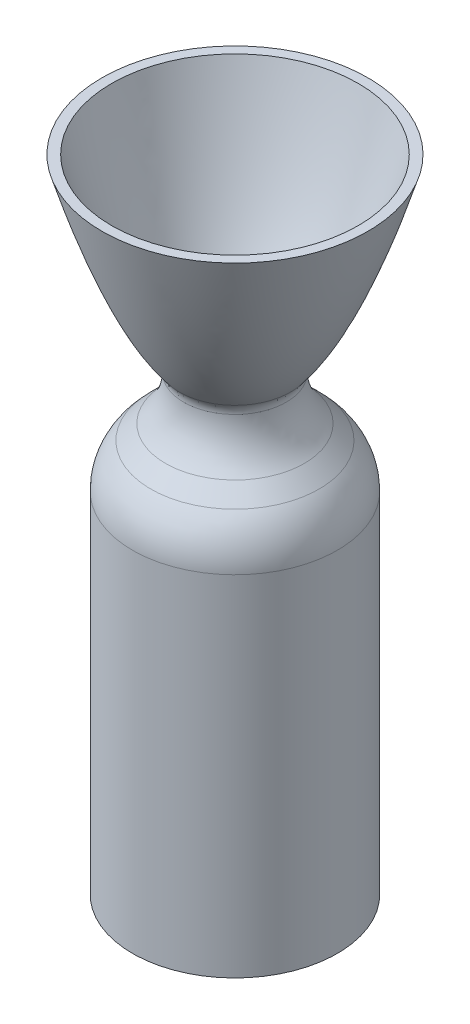
ISO-10303-21;
HEADER;
FILE_DESCRIPTION(('STEP AP214'),'2;1');
FILE_NAME('part.step','',(''),(''),'','','');
FILE_SCHEMA(('AUTOMOTIVE_DESIGN { 1 0 10303 214 1 1 1 1 }'));
ENDSEC;
DATA;
#1=APPLICATION_CONTEXT('core data for automotive mechanical design processes');
#2=APPLICATION_PROTOCOL_DEFINITION('international standard','automotive_design',2000,#1);
#3=PRODUCT_CONTEXT('',#1,'mechanical');
#4=PRODUCT('Part','Part','',(#3));
#5=PRODUCT_RELATED_PRODUCT_CATEGORY('part','',(#4));
#6=PRODUCT_DEFINITION_FORMATION('','',#4);
#7=PRODUCT_DEFINITION_CONTEXT('part definition',#1,'design');
#8=PRODUCT_DEFINITION('design','',#6,#7);
#9=PRODUCT_DEFINITION_SHAPE('','',#8);
#10=(LENGTH_UNIT() NAMED_UNIT(*) SI_UNIT(.MILLI.,.METRE.));
#11=(NAMED_UNIT(*) PLANE_ANGLE_UNIT() SI_UNIT($,.RADIAN.));
#12=(NAMED_UNIT(*) SI_UNIT($,.STERADIAN.) SOLID_ANGLE_UNIT());
#13=UNCERTAINTY_MEASURE_WITH_UNIT(LENGTH_MEASURE(1.E-05),#10,'distance_accuracy_value','');
#14=(GEOMETRIC_REPRESENTATION_CONTEXT(3) GLOBAL_UNCERTAINTY_ASSIGNED_CONTEXT((#13)) GLOBAL_UNIT_ASSIGNED_CONTEXT((#10,
#11,#12)) REPRESENTATION_CONTEXT('',''));
#15=CARTESIAN_POINT('',(0.,0.,0.));
#16=DIRECTION('',(0.,0.,1.));
#17=DIRECTION('',(1.,0.,0.));
#18=AXIS2_PLACEMENT_3D('',#15,#16,#17);
#19=CARTESIAN_POINT('',(26.7952792027428,6.50940032259606,0.));
#20=CARTESIAN_POINT('',(26.7445202608235,6.45863951350679,0.));
#21=CARTESIAN_POINT('',(26.67044207019,6.38228245127863,0.));
#22=CARTESIAN_POINT('',(26.5045552478752,6.20880231837584,0.));
#23=CARTESIAN_POINT('',(26.3663457558084,6.0501123088261,0.));
#24=CARTESIAN_POINT('',(26.1788763741962,5.83307431955689,0.));
#25=CARTESIAN_POINT('',(26.0044054743904,5.61088821502492,0.));
#26=CARTESIAN_POINT('',(25.7917882699891,5.32567960819241,0.));
#27=CARTESIAN_POINT('',(25.6025147209982,5.0458645334822,0.));
#28=CARTESIAN_POINT('',(25.41648850457,4.75146224774109,0.));
#29=CARTESIAN_POINT('',(25.2460122224941,4.45494379501456,0.));
#30=CARTESIAN_POINT('',(25.0840703005529,4.14944285659226,0.));
#31=CARTESIAN_POINT('',(24.935285976811,3.8398274049797,0.));
#32=CARTESIAN_POINT('',(24.7971967711735,3.52378782945289,0.));
#33=CARTESIAN_POINT('',(24.6716190705559,3.20350771325653,0.));
#34=CARTESIAN_POINT('',(24.5577414131155,2.87825331698411,0.));
#35=CARTESIAN_POINT('',(24.4563235712815,2.54940009295196,0.));
#36=CARTESIAN_POINT('',(24.3671416013245,2.21651509223236,0.));
#37=CARTESIAN_POINT('',(24.2905437014453,1.88115744920019,0.));
#38=CARTESIAN_POINT('',(24.2264993053653,1.54221117006489,0.));
#39=CARTESIAN_POINT('',(24.1751847188441,1.20269794512489,0.));
#40=CARTESIAN_POINT('',(24.1414350870908,0.90159400009664,0.));
#41=CARTESIAN_POINT('',(24.1205335987741,0.646924938525799,0.));
#42=CARTESIAN_POINT('',(24.1084615678794,0.427224789349872,0.));
#43=CARTESIAN_POINT('',(24.1020237227721,0.267801741635842,0.));
#44=CARTESIAN_POINT('',(24.099606331446,0.110274361763279,0.));
#45=CARTESIAN_POINT('',(24.0990685004946,0.0360533244193808,0.));
#46=CARTESIAN_POINT('',(24.0990678740505,0.000160672239889663,0.));
#47=B_SPLINE_CURVE_WITH_KNOTS('',4,(#19,#20,#21,#22,#23,#24,#25,#26,#27,#28,#29,#30,#31,#32,#33,
#34,#35,#36,#37,#38,#39,#40,#41,#42,#43,#44,#45,#46),.UNSPECIFIED.,.F.,.F.,(5,1,1,1,1,1,1,1,1,1,
1,1,1,1,1,1,1,1,1,1,1,1,1,1,5),(0.0825688161645696,0.122284452541055,0.142142270729318,
0.162000088917581,0.201715725294151,0.241431361670644,0.281146998047181,0.320862634423759,
0.360578270800262,0.400293907176806,0.440009543553384,0.479725179929891,0.519440816306429,
0.55915645268299,0.598872089059496,0.638587725436031,0.678303361812587,0.718018998189109,
0.75773463456565,0.797450270942201,0.837165907318734,0.857023725507005,0.876881543695275,
0.896739361883545,0.916597180071815),.UNSPECIFIED.);
#48=CARTESIAN_POINT('',(-0.00553212594954357,165.815985113531,0.));
#49=DIRECTION('',(0.,1.,0.));
#50=AXIS1_PLACEMENT('',#48,#49);
#51=SURFACE_OF_REVOLUTION('',#47,#50);
#52=CARTESIAN_POINT('',(-0.00553212594953341,0.000160669695714599,0.));
#53=DIRECTION('',(0.,1.,0.));
#54=DIRECTION('',(-1.,0.,0.));
#55=AXIS2_PLACEMENT_3D('',#52,#53,#54);
#56=CIRCLE('',#55,24.1045999999996);
#57=CARTESIAN_POINT('',(-24.1101321259491,0.000160669695713123,0.));
#58=VERTEX_POINT('',#57);
#59=EDGE_CURVE('E10',#58,#58,#56,.T.);
#60=ORIENTED_EDGE('',*,*,#59,.F.);
#61=EDGE_LOOP('',(#60));
#62=FACE_BOUND('',#61,.T.);
#63=CARTESIAN_POINT('',(-0.00553212594953381,6.50940032258687,0.));
#64=DIRECTION('',(0.,1.,0.));
#65=DIRECTION('',(-1.,0.,0.));
#66=AXIS2_PLACEMENT_3D('',#63,#64,#65);
#67=CIRCLE('',#66,26.8008113287013);
#68=CARTESIAN_POINT('',(-26.8063434546508,6.50940032258687,0.));
#69=VERTEX_POINT('',#68);
#70=EDGE_CURVE('E97',#69,#69,#67,.T.);
#71=ORIENTED_EDGE('',*,*,#70,.T.);
#72=EDGE_LOOP('',(#71));
#73=FACE_BOUND('',#72,.T.);
#74=ADVANCED_FACE('F37',(#62,#73),#51,.T.);
#75=CARTESIAN_POINT('',(24.09906787405,0.000160669695717676,0.));
#76=CARTESIAN_POINT('',(24.0990691047241,-0.0703679728464028,0.));
#77=CARTESIAN_POINT('',(24.0995982518181,-0.213423515475775,0.));
#78=CARTESIAN_POINT('',(24.1019739368417,-0.543022241674872,0.));
#79=CARTESIAN_POINT('',(24.1082983308862,-0.823999722416123,0.));
#80=CARTESIAN_POINT('',(24.1177834517832,-1.19466139734302,0.));
#81=CARTESIAN_POINT('',(24.1304257444387,-1.51327438396519,0.));
#82=CARTESIAN_POINT('',(24.1462259681665,-1.86177892891116,0.));
#83=CARTESIAN_POINT('',(24.1651812265014,-2.1935461974863,0.));
#84=CARTESIAN_POINT('',(24.1928188404251,-2.61790872568206,0.));
#85=CARTESIAN_POINT('',(24.2322870468909,-3.12187327267419,0.));
#86=CARTESIAN_POINT('',(24.3032997068341,-3.87981800096344,0.));
#87=CARTESIAN_POINT('',(24.4231266776924,-4.88628971453291,0.));
#88=CARTESIAN_POINT('',(24.5994860434932,-6.05655008714044,0.));
#89=CARTESIAN_POINT('',(24.8508852325236,-7.3850057422046,0.));
#90=CARTESIAN_POINT('',(25.1517953128692,-8.70341384262426,0.));
#91=CARTESIAN_POINT('',(25.5017706228882,-10.0094765375532,0.));
#92=CARTESIAN_POINT('',(25.9003609829589,-11.3016589265388,0.));
#93=CARTESIAN_POINT('',(26.3469453912588,-12.5779386658287,0.));
#94=CARTESIAN_POINT('',(26.8410033222054,-13.836726816028,0.));
#95=CARTESIAN_POINT('',(27.3816731213276,-15.0760364620747,0.));
#96=CARTESIAN_POINT('',(27.9684793860395,-16.2944491284191,0.));
#97=CARTESIAN_POINT('',(28.6001393970973,-17.4897781300036,0.));
#98=CARTESIAN_POINT('',(29.2765323953204,-18.661127094671,0.));
#99=CARTESIAN_POINT('',(29.9954451013151,-19.8055827357916,0.));
#100=CARTESIAN_POINT('',(30.7580219988686,-20.923699415831,0.));
#101=CARTESIAN_POINT('',(31.4591671920663,-21.8742511029654,0.));
#102=CARTESIAN_POINT('',(32.0887361224365,-22.6732848246303,0.));
#103=CARTESIAN_POINT('',(32.6241284158288,-23.3202614836393,0.));
#104=CARTESIAN_POINT('',(33.0722557674936,-23.8398443629595,0.));
#105=CARTESIAN_POINT('',(33.5084500255292,-24.3296555937091,0.));
#106=CARTESIAN_POINT('',(33.9358261207056,-24.7883237382633,0.));
#107=CARTESIAN_POINT('',(34.2455586391248,-25.1137076594102,0.));
#108=CARTESIAN_POINT('',(34.5368599569202,-25.4094883967124,0.));
#109=CARTESIAN_POINT('',(34.6364124248714,-25.5097892822269,0.));
#110=CARTESIAN_POINT('',(34.686282802579,-25.5596614673369,0.));
#111=B_SPLINE_CURVE_WITH_KNOTS('',4,(#75,#76,#77,#78,#79,#80,#81,#82,#83,#84,#85,#86,#87,#88,
#89,#90,#91,#92,#93,#94,#95,#96,#97,#98,#99,#100,#101,#102,#103,#104,#105,#106,#107,#108,#109,
#110),.UNSPECIFIED.,.F.,.F.,(5,1,1,1,1,1,1,1,1,1,1,1,1,1,1,1,1,1,1,1,1,1,1,1,1,1,1,1,1,1,1,1,5),
(0.0826377294276975,0.0925749264345495,0.10251212335078,0.11244932026701,0.122386517183241,
0.132323714099471,0.142260911015702,0.152198107931932,0.162135304848163,0.182009698680624,
0.201884092513085,0.241632880178006,0.281381667842927,0.321130455507848,0.360879243172768,
0.400628030837689,0.44037681850261,0.480125606167531,0.519874393832452,0.559623181497373,
0.599371969162294,0.639120756827214,0.678869544492136,0.718618332157059,0.758367119821983,
0.798115907486907,0.817990301319368,0.837864695151829,0.857739088984291,0.877613482816753,
0.897487876649217,0.907425073565449,0.917362270388778),.UNSPECIFIED.);
#112=CARTESIAN_POINT('',(-0.00553212594954357,165.815985113531,0.));
#113=DIRECTION('',(0.,1.,0.));
#114=AXIS1_PLACEMENT('',#112,#113);
#115=SURFACE_OF_REVOLUTION('',#111,#114);
#116=CARTESIAN_POINT('',(-0.00553212594953185,-25.5596614655474,0.));
#117=DIRECTION('',(0.,1.,0.));
#118=DIRECTION('',(-1.,0.,0.));
#119=AXIS2_PLACEMENT_3D('',#116,#117,#118);
#120=CIRCLE('',#119,34.6918149267068);
#121=CARTESIAN_POINT('',(-34.6973470526563,-25.5596614655474,0.));
#122=VERTEX_POINT('',#121);
#123=EDGE_CURVE('E45',#122,#122,#120,.T.);
#124=ORIENTED_EDGE('',*,*,#123,.F.);
#125=EDGE_LOOP('',(#124));
#126=FACE_BOUND('',#125,.T.);
#127=ORIENTED_EDGE('',*,*,#59,.T.);
#128=EDGE_LOOP('',(#127));
#129=FACE_BOUND('',#128,.T.);
#130=ADVANCED_FACE('F180',(#126,#129),#115,.T.);
#131=CARTESIAN_POINT('',(-0.00553212594953185,-25.5596614655474,0.));
#132=DIRECTION('',(0.,-1.,0.));
#133=DIRECTION('',(1.,0.,0.));
#134=AXIS2_PLACEMENT_3D('',#131,#132,#133);
#135=CONICAL_SURFACE('',#134,34.6918149267068,0.785398163415743);
#136=CARTESIAN_POINT('',(-0.00553212594953132,-34.1672896589686,0.));
#137=DIRECTION('',(0.,1.,0.));
#138=DIRECTION('',(-1.,0.,0.));
#139=AXIS2_PLACEMENT_3D('',#136,#137,#138);
#140=CIRCLE('',#139,43.2994431204428);
#141=CARTESIAN_POINT('',(-43.3049752463924,-34.1672896589686,0.));
#142=VERTEX_POINT('',#141);
#143=EDGE_CURVE('E50',#142,#142,#140,.T.);
#144=ORIENTED_EDGE('',*,*,#143,.F.);
#145=EDGE_LOOP('',(#144));
#146=FACE_BOUND('',#145,.T.);
#147=ORIENTED_EDGE('',*,*,#123,.T.);
#148=EDGE_LOOP('',(#147));
#149=FACE_BOUND('',#148,.T.);
#150=ADVANCED_FACE('F177',(#146,#149),#135,.F.);
#151=CARTESIAN_POINT('',(43.2939109944933,-34.1672896589686,0.));
#152=CARTESIAN_POINT('',(43.3437831535067,-34.2171620577288,0.));
#153=CARTESIAN_POINT('',(43.4443920749249,-34.3185162902184,0.));
#154=CARTESIAN_POINT('',(43.6740724087182,-34.5515494534129,0.));
#155=CARTESIAN_POINT('',(43.8739246264303,-34.7603401537522,0.));
#156=CARTESIAN_POINT('',(44.1814575050495,-35.0846311877743,0.));
#157=CARTESIAN_POINT('',(44.5147761918711,-35.446992659837,0.));
#158=CARTESIAN_POINT('',(44.9151269502498,-35.894247635304,0.));
#159=CARTESIAN_POINT('',(45.3528176825578,-36.4033812848166,0.));
#160=CARTESIAN_POINT('',(45.8935379392349,-37.0556721252782,0.));
#161=CARTESIAN_POINT('',(46.5198690622394,-37.8514517879027,0.));
#162=CARTESIAN_POINT('',(47.2231021398004,-38.8040762419941,0.));
#163=CARTESIAN_POINT('',(47.9844755213228,-39.9209726601051,0.));
#164=CARTESIAN_POINT('',(48.7041252303995,-41.0661548819658,0.));
#165=CARTESIAN_POINT('',(49.3801202320298,-42.2370932420432,0.));
#166=CARTESIAN_POINT('',(50.0120609291092,-43.4327015290297,0.));
#167=CARTESIAN_POINT('',(50.5987337538324,-44.6509688067741,0.));
#168=CARTESIAN_POINT('',(51.1395203620782,-45.8904084086378,0.));
#169=CARTESIAN_POINT('',(51.6335378319878,-47.1491350703917,0.));
#170=CARTESIAN_POINT('',(52.0243487401519,-48.2659692269763,0.));
#171=CARTESIAN_POINT('',(52.3292893411448,-49.23307774357,0.));
#172=CARTESIAN_POINT('',(52.6100142250863,-50.2074890415895,0.));
#173=CARTESIAN_POINT('',(52.8663751209586,-51.1885390868044,0.));
#174=CARTESIAN_POINT('',(53.0920641875106,-52.177442824755,0.));
#175=CARTESIAN_POINT('',(53.2868108227221,-53.1724252432346,0.));
#176=CARTESIAN_POINT('',(53.4566757867642,-54.17243543369,0.));
#177=CARTESIAN_POINT('',(53.5774268617541,-55.0081658638423,0.));
#178=CARTESIAN_POINT('',(53.6772884520342,-55.8484803692716,0.));
#179=CARTESIAN_POINT('',(53.756193121668,-56.6879981686387,0.));
#180=CARTESIAN_POINT('',(53.8004052848377,-57.2809599026071,0.));
#181=CARTESIAN_POINT('',(53.8304176257544,-57.7815944461254,0.));
#182=CARTESIAN_POINT('',(53.8501684535017,-58.2128376252088,0.));
#183=CARTESIAN_POINT('',(53.8628113510331,-58.5325674911422,0.));
#184=CARTESIAN_POINT('',(53.8722968380763,-58.9047954961338,0.));
#185=CARTESIAN_POINT('',(53.8786214369125,-59.1815646199112,0.));
#186=CARTESIAN_POINT('',(53.8809972871621,-59.5154061063821,0.));
#187=CARTESIAN_POINT('',(53.881526430117,-59.6569831600376,0.));
#188=CARTESIAN_POINT('',(53.8815276614586,-59.7275132132153,0.));
#189=B_SPLINE_CURVE_WITH_KNOTS('',4,(#151,#152,#153,#154,#155,#156,#157,#158,#159,#160,#161,
#162,#163,#164,#165,#166,#167,#168,#169,#170,#171,#172,#173,#174,#175,#176,#177,#178,#179,#180,
#181,#182,#183,#184,#185,#186,#187,#188),.UNSPECIFIED.,.F.,.F.,(5,1,1,1,1,1,1,1,1,1,1,1,1,1,1,1,
1,1,1,1,1,1,1,1,1,1,1,1,1,1,1,1,1,1,5),(0.0826377291939756,0.0925749257903485,0.102512122706581,
0.112449319622813,0.122386516539045,0.142260910371506,0.162135304203967,0.182009698036428,
0.201884091868889,0.24163287953381,0.281381667198732,0.321130454863653,0.360879242528575,
0.400628030193497,0.440376817858418,0.48012560552334,0.519874393188261,0.559623180853182,
0.599371968518103,0.619246362350565,0.639120756183026,0.678869543847947,0.718618331512868,
0.738492725345329,0.75836711917779,0.798115906842711,0.817990300675172,0.837864694507633,
0.857739088340094,0.867676285256324,0.877613482172555,0.887550679088785,0.897487876005016,
0.907425072921246,0.917362270161818),.UNSPECIFIED.);
#190=CARTESIAN_POINT('',(-0.00553212594954357,165.815985113531,0.));
#191=DIRECTION('',(0.,1.,0.));
#192=AXIS1_PLACEMENT('',#190,#191);
#193=SURFACE_OF_REVOLUTION('',#189,#192);
#194=CARTESIAN_POINT('',(-0.00553212594952976,-59.7275132223151,0.));
#195=DIRECTION('',(0.,1.,0.));
#196=DIRECTION('',(-1.,0.,0.));
#197=AXIS2_PLACEMENT_3D('',#194,#195,#196);
#198=CIRCLE('',#197,53.8870597874087);
#199=CARTESIAN_POINT('',(-53.8925919133582,-59.7275132223151,0.));
#200=VERTEX_POINT('',#199);
#201=EDGE_CURVE('E55',#200,#200,#198,.T.);
#202=ORIENTED_EDGE('',*,*,#201,.F.);
#203=EDGE_LOOP('',(#202));
#204=FACE_BOUND('',#203,.T.);
#205=ORIENTED_EDGE('',*,*,#143,.T.);
#206=EDGE_LOOP('',(#205));
#207=FACE_BOUND('',#206,.T.);
#208=ADVANCED_FACE('F173',(#204,#207),#193,.T.);
#209=CARTESIAN_POINT('',(-0.00553212594954357,165.815985113531,0.));
#210=DIRECTION('',(0.,1.,0.));
#211=DIRECTION('',(-1.,0.,0.));
#212=AXIS2_PLACEMENT_3D('',#209,#210,#211);
#213=CYLINDRICAL_SURFACE('',#212,53.8870597874087);
#214=CARTESIAN_POINT('',(-0.00553212594951731,-262.927513222315,0.));
#215=DIRECTION('',(0.,1.,0.));
#216=DIRECTION('',(-1.,0.,0.));
#217=AXIS2_PLACEMENT_3D('',#214,#215,#216);
#218=CIRCLE('',#217,53.8870597874087);
#219=CARTESIAN_POINT('',(-53.8925919133582,-262.927513222315,0.));
#220=VERTEX_POINT('',#219);
#221=EDGE_CURVE('E61',#220,#220,#218,.T.);
#222=ORIENTED_EDGE('',*,*,#221,.F.);
#223=EDGE_LOOP('',(#222));
#224=FACE_BOUND('',#223,.T.);
#225=ORIENTED_EDGE('',*,*,#201,.T.);
#226=EDGE_LOOP('',(#225));
#227=FACE_BOUND('',#226,.T.);
#228=ADVANCED_FACE('F169',(#224,#227),#213,.F.);
#229=CARTESIAN_POINT('',(-0.00553212594951731,-262.927513222315,0.));
#230=DIRECTION('',(0.,-1.,0.));
#231=DIRECTION('',(1.,0.,0.));
#232=AXIS2_PLACEMENT_3D('',#229,#230,#231);
#233=CONICAL_SURFACE('',#232,53.8870597874087,1.56778422709488);
#234=CARTESIAN_POINT('',(-0.00553212594951731,-262.944683547694,0.));
#235=DIRECTION('',(0.,1.,0.));
#236=DIRECTION('',(-1.,0.,0.));
#237=AXIS2_PLACEMENT_3D('',#234,#235,#236);
#238=CIRCLE('',#237,59.5874930935831);
#239=CARTESIAN_POINT('',(-59.5930252195326,-262.944683547694,0.));
#240=VERTEX_POINT('',#239);
#241=EDGE_CURVE('E65',#240,#240,#238,.T.);
#242=ORIENTED_EDGE('',*,*,#241,.F.);
#243=EDGE_LOOP('',(#242));
#244=FACE_BOUND('',#243,.T.);
#245=ORIENTED_EDGE('',*,*,#221,.T.);
#246=EDGE_LOOP('',(#245));
#247=FACE_BOUND('',#246,.T.);
#248=ADVANCED_FACE('F165',(#244,#247),#233,.F.);
#249=CARTESIAN_POINT('',(-0.00553212594954357,165.815985113531,0.));
#250=DIRECTION('',(0.,1.,0.));
#251=DIRECTION('',(-1.,0.,0.));
#252=AXIS2_PLACEMENT_3D('',#249,#250,#251);
#253=CYLINDRICAL_SURFACE('',#252,59.5874930935828);
#254=CARTESIAN_POINT('',(-0.00553212594952975,-59.7446835385943,0.));
#255=DIRECTION('',(0.,1.,0.));
#256=DIRECTION('',(-1.,0.,0.));
#257=AXIS2_PLACEMENT_3D('',#254,#255,#256);
#258=CIRCLE('',#257,59.5874930935825);
#259=CARTESIAN_POINT('',(-59.593025219532,-59.7446835385943,0.));
#260=VERTEX_POINT('',#259);
#261=EDGE_CURVE('E69',#260,#260,#258,.T.);
#262=ORIENTED_EDGE('',*,*,#261,.F.);
#263=EDGE_LOOP('',(#262));
#264=FACE_BOUND('',#263,.T.);
#265=ORIENTED_EDGE('',*,*,#241,.T.);
#266=EDGE_LOOP('',(#265));
#267=FACE_BOUND('',#266,.T.);
#268=ADVANCED_FACE('F161',(#264,#267),#253,.T.);
#269=CARTESIAN_POINT('',(59.5819609676329,-59.7446835385943,0.));
#270=CARTESIAN_POINT('',(59.5819597362459,-59.6741534854167,0.));
#271=CARTESIAN_POINT('',(59.5814305931997,-59.5325764317615,0.));
#272=CARTESIAN_POINT('',(59.5790547427348,-59.1987349452921,0.));
#273=CARTESIAN_POINT('',(59.5727301437201,-58.9219658215188,0.));
#274=CARTESIAN_POINT('',(59.5632446564368,-58.5497378165334,0.));
#275=CARTESIAN_POINT('',(59.5506017586993,-58.2300079506081,0.));
#276=CARTESIAN_POINT('',(59.5308509306739,-57.7987647715375,0.));
#277=CARTESIAN_POINT('',(59.5008385894344,-57.2981302280386,0.));
#278=CARTESIAN_POINT('',(59.4566264258823,-56.7051684940986,0.));
#279=CARTESIAN_POINT('',(59.3777217557071,-55.8656506947824,0.));
#280=CARTESIAN_POINT('',(59.2778601648851,-55.0253361894175,0.));
#281=CARTESIAN_POINT('',(59.1571090893563,-54.1896057593431,0.));
#282=CARTESIAN_POINT('',(58.9872441246693,-53.1895955689972,0.));
#283=CARTESIAN_POINT('',(58.7924974888162,-52.1946131506432,0.));
#284=CARTESIAN_POINT('',(58.5668084216265,-51.2057094128381,0.));
#285=CARTESIAN_POINT('',(58.3104475251215,-50.2246593677886,0.));
#286=CARTESIAN_POINT('',(58.0297226405517,-49.2502480699501,0.));
#287=CARTESIAN_POINT('',(57.7247820389351,-48.283139553553,0.));
#288=CARTESIAN_POINT('',(57.3339711300508,-47.1663053972204,0.));
#289=CARTESIAN_POINT('',(56.8399536593295,-45.9075787357851,0.));
#290=CARTESIAN_POINT('',(56.2991670502845,-44.6681391342701,0.));
#291=CARTESIAN_POINT('',(55.7124942247757,-43.4498718569041,0.));
#292=CARTESIAN_POINT('',(55.0805535269252,-42.2542635703251,0.));
#293=CARTESIAN_POINT('',(54.4045585245399,-41.0833252106836,0.));
#294=CARTESIAN_POINT('',(53.6849088147246,-39.938142989287,0.));
#295=CARTESIAN_POINT('',(52.923535432482,-38.821246571667,0.));
#296=CARTESIAN_POINT('',(52.2203023543067,-37.868622118029,0.));
#297=CARTESIAN_POINT('',(51.593971230789,-37.0728424558085,0.));
#298=CARTESIAN_POINT('',(51.0532509736912,-36.4205516156956,0.));
#299=CARTESIAN_POINT('',(50.615560241055,-35.9114179664652,0.));
#300=CARTESIAN_POINT('',(50.2152094823879,-35.4641629912564,0.));
#301=CARTESIAN_POINT('',(49.8818907953326,-35.1018015194086,0.));
#302=CARTESIAN_POINT('',(49.5743579165043,-34.7775104855849,0.));
#303=CARTESIAN_POINT('',(49.3745056986575,-34.5687197853744,0.));
#304=CARTESIAN_POINT('',(49.1448253647139,-34.335686622328,0.));
#305=CARTESIAN_POINT('',(49.0442164432304,-34.2343323899033,0.));
#306=CARTESIAN_POINT('',(48.9943442841848,-34.1844599911752,0.));
#307=B_SPLINE_CURVE_WITH_KNOTS('',4,(#269,#270,#271,#272,#273,#274,#275,#276,#277,#278,#279,
#280,#281,#282,#283,#284,#285,#286,#287,#288,#289,#290,#291,#292,#293,#294,#295,#296,#297,#298,
#299,#300,#301,#302,#303,#304,#305,#306),.UNSPECIFIED.,.F.,.F.,(5,1,1,1,1,1,1,1,1,1,1,1,1,1,1,1,
1,1,1,1,1,1,1,1,1,1,1,1,1,1,1,1,1,1,5),(0.0826377291939837,0.0925749264345476,0.102512123350778,
0.112449320267009,0.122386517183239,0.132323714099469,0.1422609110157,0.162135304848161,
0.182009698680622,0.201884092513083,0.241632880178004,0.261507274010465,0.281381667842925,
0.321130455507847,0.360879243172768,0.380753637005229,0.40062803083769,0.440376818502612,
0.480125606167533,0.519874393832454,0.559623181497376,0.599371969162297,0.639120756827219,
0.67886954449214,0.718618332157062,0.758367119821984,0.798115907486905,0.817990301319366,
0.837864695151827,0.857739088984288,0.877613482816748,0.887550679732981,0.897487876649213,
0.907425073565445,0.917362270161824),.UNSPECIFIED.);
#308=CARTESIAN_POINT('',(-0.00553212594954357,165.815985113531,0.));
#309=DIRECTION('',(0.,1.,0.));
#310=AXIS1_PLACEMENT('',#308,#309);
#311=SURFACE_OF_REVOLUTION('',#307,#310);
#312=CARTESIAN_POINT('',(-0.00553212594953132,-34.1844599976285,0.));
#313=DIRECTION('',(0.,1.,0.));
#314=DIRECTION('',(-1.,0.,0.));
#315=AXIS2_PLACEMENT_3D('',#312,#313,#314);
#316=CIRCLE('',#315,48.9998764165239);
#317=CARTESIAN_POINT('',(-49.0054085424734,-34.1844599976285,0.));
#318=VERTEX_POINT('',#317);
#319=EDGE_CURVE('E73',#318,#318,#316,.T.);
#320=ORIENTED_EDGE('',*,*,#319,.F.);
#321=EDGE_LOOP('',(#320));
#322=FACE_BOUND('',#321,.T.);
#323=ORIENTED_EDGE('',*,*,#261,.T.);
#324=EDGE_LOOP('',(#323));
#325=FACE_BOUND('',#324,.T.);
#326=ADVANCED_FACE('F157',(#322,#325),#311,.T.);
#327=CARTESIAN_POINT('',(-0.00553212594953132,-34.1844599976285,0.));
#328=DIRECTION('',(0.,-1.,0.));
#329=DIRECTION('',(1.,0.,0.));
#330=AXIS2_PLACEMENT_3D('',#327,#328,#329);
#331=CONICAL_SURFACE('',#330,48.9998764165239,0.785398163410157);
#332=CARTESIAN_POINT('',(-0.00553212594953185,-25.5768317995429,0.));
#333=DIRECTION('',(0.,1.,0.));
#334=DIRECTION('',(-1.,0.,0.));
#335=AXIS2_PLACEMENT_3D('',#332,#333,#334);
#336=CIRCLE('',#335,40.3922482182196);
#337=CARTESIAN_POINT('',(-40.3977803441691,-25.5768317995429,0.));
#338=VERTEX_POINT('',#337);
#339=EDGE_CURVE('E77',#338,#338,#336,.T.);
#340=ORIENTED_EDGE('',*,*,#339,.F.);
#341=EDGE_LOOP('',(#340));
#342=FACE_BOUND('',#341,.T.);
#343=ORIENTED_EDGE('',*,*,#319,.T.);
#344=EDGE_LOOP('',(#343));
#345=FACE_BOUND('',#344,.T.);
#346=ADVANCED_FACE('F160',(#342,#345),#331,.T.);
#347=CARTESIAN_POINT('',(40.38671609227,-25.5768317995429,0.));
#348=CARTESIAN_POINT('',(40.3368457145353,-25.52695961446,0.));
#349=CARTESIAN_POINT('',(40.2372932465299,-25.4266587289994,0.));
#350=CARTESIAN_POINT('',(39.9459919285743,-25.1308779918549,0.));
#351=CARTESIAN_POINT('',(39.6362594099789,-24.8054940708758,0.));
#352=CARTESIAN_POINT('',(39.208883314554,-24.346825926553,0.));
#353=CARTESIAN_POINT('',(38.7726890562532,-23.8570146960396,0.));
#354=CARTESIAN_POINT('',(38.324561704307,-23.3374318169621,0.));
#355=CARTESIAN_POINT('',(37.7891694105643,-22.6904551582431,0.));
#356=CARTESIAN_POINT('',(37.1596004797613,-21.8914214369192,0.));
#357=CARTESIAN_POINT('',(36.4584552860488,-20.9408697501645,0.));
#358=CARTESIAN_POINT('',(35.6958783878899,-19.8227530705381,0.));
#359=CARTESIAN_POINT('',(34.9769656812753,-18.6782974298068,0.));
#360=CARTESIAN_POINT('',(34.3005726824179,-17.5069484655058,0.));
#361=CARTESIAN_POINT('',(33.6689126707127,-16.3116194642633,0.));
#362=CARTESIAN_POINT('',(33.0821064053408,-15.0932067982367,0.));
#363=CARTESIAN_POINT('',(32.5414366055475,-13.8538971524829,0.));
#364=CARTESIAN_POINT('',(32.0473786739191,-12.5951090025511,0.));
#365=CARTESIAN_POINT('',(31.6007942649281,-11.3188292635031,0.));
#366=CARTESIAN_POINT('',(31.2022039041576,-10.0266468747334,0.));
#367=CARTESIAN_POINT('',(30.8522285934312,-8.72058417999397,0.));
#368=CARTESIAN_POINT('',(30.5513185123716,-7.40217607973728,0.));
#369=CARTESIAN_POINT('',(30.2999193226217,-6.07372042480927,0.));
#370=CARTESIAN_POINT('',(30.1235599561871,-4.90346005229725,0.));
#371=CARTESIAN_POINT('',(30.0037329847837,-3.89698833879268,0.));
#372=CARTESIAN_POINT('',(29.93272032443,-3.13904361054189,0.));
#373=CARTESIAN_POINT('',(29.8932521176913,-2.63507906357114,0.));
#374=CARTESIAN_POINT('',(29.8656145035378,-2.21071653539034,0.));
#375=CARTESIAN_POINT('',(29.8466592450232,-1.87894926682547,0.));
#376=CARTESIAN_POINT('',(29.8308590211067,-1.53044472188806,0.));
#377=CARTESIAN_POINT('',(29.8182167282787,-1.21183173527272,0.));
#378=CARTESIAN_POINT('',(29.8087316071809,-0.841170060350969,0.));
#379=CARTESIAN_POINT('',(29.8024072129842,-0.560192579613143,0.));
#380=CARTESIAN_POINT('',(29.8000315277821,-0.230593853415333,0.));
#381=CARTESIAN_POINT('',(29.7995023806107,-0.0875383107862467,0.));
#382=CARTESIAN_POINT('',(29.7995011498984,-0.0170096682441269,0.));
#383=B_SPLINE_CURVE_WITH_KNOTS('',4,(#347,#348,#349,#350,#351,#352,#353,#354,#355,#356,#357,
#358,#359,#360,#361,#362,#363,#364,#365,#366,#367,#368,#369,#370,#371,#372,#373,#374,#375,#376,
#377,#378,#379,#380,#381,#382),.UNSPECIFIED.,.F.,.F.,(5,1,1,1,1,1,1,1,1,1,1,1,1,1,1,1,1,1,1,1,1,
1,1,1,1,1,1,1,1,1,1,1,5),(0.082637729427731,0.0925749262510766,0.102512123167309,
0.122386516999773,0.142260910832234,0.162135304664696,0.182009698497157,0.201884092329619,
0.241632879994542,0.281381667659466,0.321130455324389,0.360879242989311,0.400628030654232,
0.440376818319152,0.480125605984073,0.519874393648994,0.559623181313916,0.599371968978837,
0.639120756643757,0.678869544308678,0.718618331973599,0.75836711963852,0.798115907303441,
0.817990301135902,0.837864694968362,0.847801891884593,0.857739088800824,0.867676285717054,
0.877613482633285,0.887550679549515,0.897487876465746,0.907425073381976,0.917362270388794),.UNSPECIFIED.);
#384=CARTESIAN_POINT('',(-0.00553212594954357,165.815985113531,0.));
#385=DIRECTION('',(0.,1.,0.));
#386=AXIS1_PLACEMENT('',#384,#385);
#387=SURFACE_OF_REVOLUTION('',#383,#386);
#388=CARTESIAN_POINT('',(-0.00553212594953341,-0.0170096657008956,0.));
#389=DIRECTION('',(0.,1.,0.));
#390=DIRECTION('',(-1.,0.,0.));
#391=AXIS2_PLACEMENT_3D('',#388,#389,#390);
#392=CIRCLE('',#391,29.8050332758479);
#393=CARTESIAN_POINT('',(-29.8105654017974,-0.0170096657008974,0.));
#394=VERTEX_POINT('',#393);
#395=EDGE_CURVE('E81',#394,#394,#392,.T.);
#396=ORIENTED_EDGE('',*,*,#395,.F.);
#397=EDGE_LOOP('',(#396));
#398=FACE_BOUND('',#397,.T.);
#399=ORIENTED_EDGE('',*,*,#339,.T.);
#400=EDGE_LOOP('',(#399));
#401=FACE_BOUND('',#400,.T.);
#402=ADVANCED_FACE('F128',(#398,#401),#387,.T.);
#403=CARTESIAN_POINT('',(29.7995011498983,-0.0170096657009076,0.));
#404=CARTESIAN_POINT('',(29.7995017763426,0.0188829864747169,0.));
#405=CARTESIAN_POINT('',(29.8000396072942,0.0931040238178571,0.));
#406=CARTESIAN_POINT('',(29.8024569986206,0.250631403682601,0.));
#407=CARTESIAN_POINT('',(29.8088948437279,0.410054451391841,0.));
#408=CARTESIAN_POINT('',(29.820966874623,0.62975460056775,0.));
#409=CARTESIAN_POINT('',(29.84186836294,0.884423662138558,0.));
#410=CARTESIAN_POINT('',(29.8756179946938,1.18552760716676,0.));
#411=CARTESIAN_POINT('',(29.9269325812155,1.52504083210667,0.));
#412=CARTESIAN_POINT('',(29.990976977296,1.86398711124188,0.));
#413=CARTESIAN_POINT('',(30.0675748771758,2.19934475427393,0.));
#414=CARTESIAN_POINT('',(30.1567568471333,2.53222975499339,0.));
#415=CARTESIAN_POINT('',(30.2581746889678,2.86108297902538,0.));
#416=CARTESIAN_POINT('',(30.3720523464086,3.18633737529763,0.));
#417=CARTESIAN_POINT('',(30.4976300470268,3.5066174914938,0.));
#418=CARTESIAN_POINT('',(30.6357192526648,3.8226570670204,0.));
#419=CARTESIAN_POINT('',(30.7845035764071,4.13227251863273,0.));
#420=CARTESIAN_POINT('',(30.9464454983488,4.43777345705478,0.));
#421=CARTESIAN_POINT('',(31.1169217804252,4.73429190978105,0.));
#422=CARTESIAN_POINT('',(31.3029479968538,5.02869419552186,0.));
#423=CARTESIAN_POINT('',(31.4922215458452,5.30850927023179,0.));
#424=CARTESIAN_POINT('',(31.7048387502469,5.59371787706397,0.));
#425=CARTESIAN_POINT('',(31.8793096500531,5.81590398159567,0.));
#426=CARTESIAN_POINT('',(32.0667790316655,6.03294197086459,0.));
#427=CARTESIAN_POINT('',(32.2049885237325,6.19163198041396,0.));
#428=CARTESIAN_POINT('',(32.3708753460472,6.36511211331613,0.));
#429=CARTESIAN_POINT('',(32.4449535366809,6.44146917554424,0.));
#430=CARTESIAN_POINT('',(32.4957124786001,6.49222998463327,0.));
#431=B_SPLINE_CURVE_WITH_KNOTS('',4,(#403,#404,#405,#406,#407,#408,#409,#410,#411,#412,#413,
#414,#415,#416,#417,#418,#419,#420,#421,#422,#423,#424,#425,#426,#427,#428,#429,#430),
.UNSPECIFIED.,.F.,.F.,(5,1,1,1,1,1,1,1,1,1,1,1,1,1,1,1,1,1,1,1,1,1,1,1,5),(0.0825688161645696,
0.102426634352839,0.122284452541109,0.14214227072938,0.16200008891765,0.201715725294183,
0.241431361670735,0.281146998047275,0.320862634423797,0.360578270800353,0.400293907176888,
0.440009543553394,0.479725179929955,0.519440816306493,0.559156452683,0.598872089059578,
0.638587725436122,0.678303361812625,0.718018998189203,0.75773463456574,0.797450270942234,
0.837165907318803,0.857023725507066,0.876881543695329,0.916597180071815),.UNSPECIFIED.);
#432=CARTESIAN_POINT('',(-0.00553212594954357,165.815985113531,0.));
#433=DIRECTION('',(0.,1.,0.));
#434=AXIS1_PLACEMENT('',#432,#433);
#435=SURFACE_OF_REVOLUTION('',#431,#434);
#436=CARTESIAN_POINT('',(-0.00553212594953381,6.49222998463328,0.));
#437=DIRECTION('',(0.,1.,0.));
#438=DIRECTION('',(-1.,0.,0.));
#439=AXIS2_PLACEMENT_3D('',#436,#437,#438);
#440=CIRCLE('',#439,32.5012446045496);
#441=CARTESIAN_POINT('',(-32.5067767304991,6.49222998463328,0.));
#442=VERTEX_POINT('',#441);
#443=EDGE_CURVE('E85',#442,#442,#440,.T.);
#444=ORIENTED_EDGE('',*,*,#443,.F.);
#445=EDGE_LOOP('',(#444));
#446=FACE_BOUND('',#445,.T.);
#447=ORIENTED_EDGE('',*,*,#395,.T.);
#448=EDGE_LOOP('',(#447));
#449=FACE_BOUND('',#448,.T.);
#450=ADVANCED_FACE('F124',(#446,#449),#435,.T.);
#451=CARTESIAN_POINT('',(32.4957124786001,6.49222998463327,0.));
#452=CARTESIAN_POINT('',(54.9510800068366,34.6275313960997,0.));
#453=CARTESIAN_POINT('',(77.3884161649985,109.927507640385,0.));
#454=B_SPLINE_CURVE_WITH_KNOTS('',2,(#451,#452,#453),.UNSPECIFIED.,.F.,.F.,(3,3),(0.,1.),.UNSPECIFIED.);
#455=CARTESIAN_POINT('',(-0.00553212594954357,165.815985113531,0.));
#456=DIRECTION('',(0.,1.,0.));
#457=AXIS1_PLACEMENT('',#455,#456);
#458=SURFACE_OF_REVOLUTION('',#454,#457);
#459=CARTESIAN_POINT('',(-0.00553212594954014,109.927507640385,0.));
#460=DIRECTION('',(0.,1.,0.));
#461=DIRECTION('',(-1.,0.,0.));
#462=AXIS2_PLACEMENT_3D('',#459,#460,#461);
#463=CIRCLE('',#462,77.393948290948);
#464=CARTESIAN_POINT('',(-77.3994804168976,109.927507640385,0.));
#465=VERTEX_POINT('',#464);
#466=EDGE_CURVE('E89',#465,#465,#463,.T.);
#467=ORIENTED_EDGE('',*,*,#466,.F.);
#468=EDGE_LOOP('',(#467));
#469=FACE_BOUND('',#468,.T.);
#470=ORIENTED_EDGE('',*,*,#443,.T.);
#471=EDGE_LOOP('',(#470));
#472=FACE_BOUND('',#471,.T.);
#473=ADVANCED_FACE('F120',(#469,#472),#458,.T.);
#474=CARTESIAN_POINT('',(71.7275236025302,109.927507640385,0.));
#475=DIRECTION('',(0.,-1.,0.));
#476=DIRECTION('',(1.,0.,0.));
#477=AXIS2_PLACEMENT_3D('',#474,#475,#476);
#478=PLANE('',#477);
#479=CARTESIAN_POINT('',(-0.00553212594954014,109.927507640385,0.));
#480=DIRECTION('',(0.,1.,0.));
#481=DIRECTION('',(-1.,0.,0.));
#482=AXIS2_PLACEMENT_3D('',#479,#480,#481);
#483=CIRCLE('',#482,71.7330557284818);
#484=CARTESIAN_POINT('',(-71.7385878544314,109.927507640385,0.));
#485=VERTEX_POINT('',#484);
#486=EDGE_CURVE('E93',#485,#485,#483,.T.);
#487=ORIENTED_EDGE('',*,*,#486,.F.);
#488=EDGE_LOOP('',(#487));
#489=FACE_BOUND('',#488,.T.);
#490=ORIENTED_EDGE('',*,*,#466,.T.);
#491=EDGE_LOOP('',(#490));
#492=FACE_BOUND('',#491,.T.);
#493=ADVANCED_FACE('F116',(#489,#492),#478,.F.);
#494=CARTESIAN_POINT('',(71.7275236025323,109.927507640385,0.));
#495=CARTESIAN_POINT('',(49.2614014026921,34.6361148416982,0.));
#496=CARTESIAN_POINT('',(26.7952792027517,6.50940032258687,0.));
#497=B_SPLINE_CURVE_WITH_KNOTS('',2,(#494,#495,#496),.UNSPECIFIED.,.F.,.F.,(3,3),(0.,1.),.UNSPECIFIED.);
#498=CARTESIAN_POINT('',(-0.00553212594954357,165.815985113531,0.));
#499=DIRECTION('',(0.,1.,0.));
#500=AXIS1_PLACEMENT('',#498,#499);
#501=SURFACE_OF_REVOLUTION('',#497,#500);
#502=ORIENTED_EDGE('',*,*,#70,.F.);
#503=EDGE_LOOP('',(#502));
#504=FACE_BOUND('',#503,.T.);
#505=ORIENTED_EDGE('',*,*,#486,.T.);
#506=EDGE_LOOP('',(#505));
#507=FACE_BOUND('',#506,.T.);
#508=ADVANCED_FACE('F113',(#504,#507),#501,.T.);
#509=CLOSED_SHELL('',(#74,#130,#150,#208,#228,#248,#268,#326,#346,#402,#450,#473,#493,#508));
#510=MANIFOLD_SOLID_BREP('B2',#509);
#511=ADVANCED_BREP_SHAPE_REPRESENTATION('',(#18,#510),#14);
#512=SHAPE_DEFINITION_REPRESENTATION(#9,#511);
ENDSEC;
END-ISO-10303-21;
